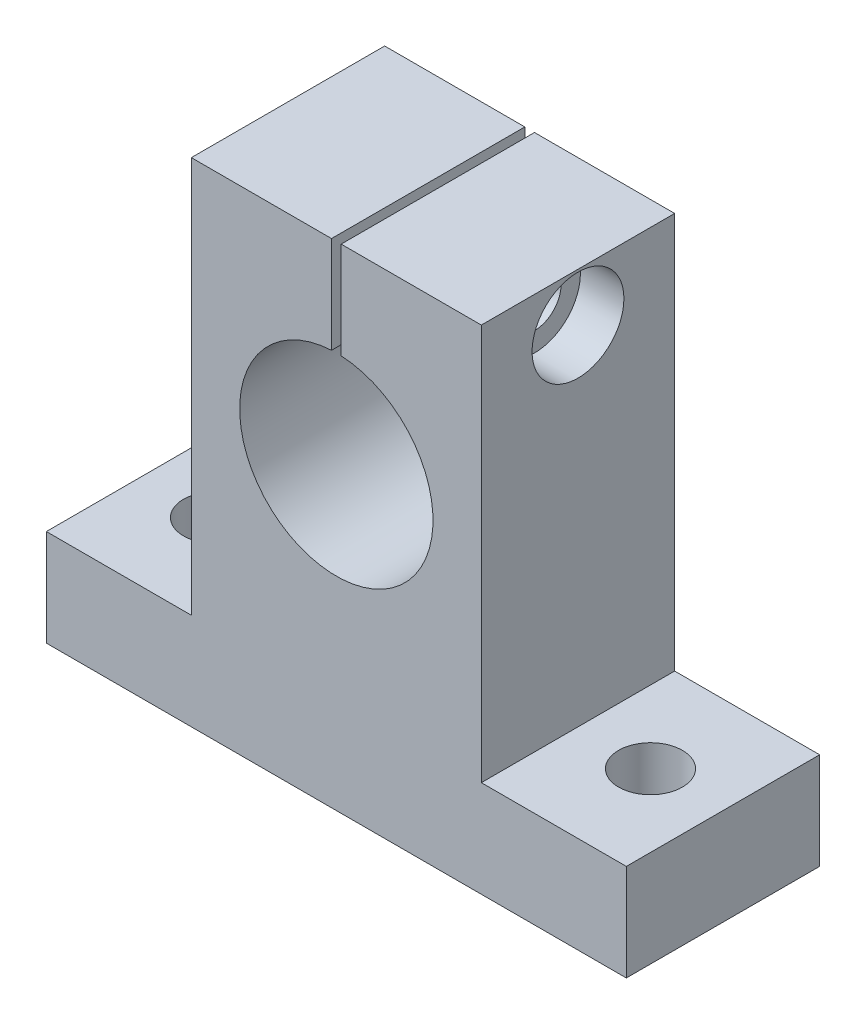
ISO-10303-21;
HEADER;
FILE_DESCRIPTION(('STEP AP214'),'2;1');
FILE_NAME('part.step','',(''),(''),'','','');
FILE_SCHEMA(('AUTOMOTIVE_DESIGN { 1 0 10303 214 1 1 1 1 }'));
ENDSEC;
DATA;
#1=APPLICATION_CONTEXT('core data for automotive mechanical design processes');
#2=APPLICATION_PROTOCOL_DEFINITION('international standard','automotive_design',2000,#1);
#3=PRODUCT_CONTEXT('',#1,'mechanical');
#4=PRODUCT('Part','Part','',(#3));
#5=PRODUCT_RELATED_PRODUCT_CATEGORY('part','',(#4));
#6=PRODUCT_DEFINITION_FORMATION('','',#4);
#7=PRODUCT_DEFINITION_CONTEXT('part definition',#1,'design');
#8=PRODUCT_DEFINITION('design','',#6,#7);
#9=PRODUCT_DEFINITION_SHAPE('','',#8);
#10=(LENGTH_UNIT() NAMED_UNIT(*) SI_UNIT(.MILLI.,.METRE.));
#11=(NAMED_UNIT(*) PLANE_ANGLE_UNIT() SI_UNIT($,.RADIAN.));
#12=(NAMED_UNIT(*) SI_UNIT($,.STERADIAN.) SOLID_ANGLE_UNIT());
#13=UNCERTAINTY_MEASURE_WITH_UNIT(LENGTH_MEASURE(1.E-05),#10,'distance_accuracy_value','');
#14=(GEOMETRIC_REPRESENTATION_CONTEXT(3) GLOBAL_UNCERTAINTY_ASSIGNED_CONTEXT((#13)) GLOBAL_UNIT_ASSIGNED_CONTEXT((#10,
#11,#12)) REPRESENTATION_CONTEXT('',''));
#15=CARTESIAN_POINT('',(0.,0.,0.));
#16=DIRECTION('',(0.,0.,1.));
#17=DIRECTION('',(1.,0.,0.));
#18=AXIS2_PLACEMENT_3D('',#15,#16,#17);
#19=CARTESIAN_POINT('',(40.8020446051646,48.6470920161527,10.));
#20=DIRECTION('',(-1.,0.,0.));
#21=DIRECTION('',(0.,0.,1.));
#22=AXIS2_PLACEMENT_3D('',#19,#20,#21);
#23=PLANE('',#22);
#24=CARTESIAN_POINT('',(40.8020446051646,43.8970920161528,10.));
#25=DIRECTION('',(1.,0.,0.));
#26=DIRECTION('',(0.,0.,-1.));
#27=AXIS2_PLACEMENT_3D('',#24,#25,#26);
#28=CIRCLE('',#27,2.74999999999998);
#29=CARTESIAN_POINT('',(40.8020446051646,43.8970920161528,7.25000000000004));
#30=VERTEX_POINT('',#29);
#31=EDGE_CURVE('E112',#30,#30,#28,.F.);
#32=ORIENTED_EDGE('',*,*,#31,.T.);
#33=EDGE_LOOP('',(#32));
#34=FACE_BOUND('',#33,.T.);
#35=CARTESIAN_POINT('',(40.8020446051646,43.8970920161528,10.));
#36=DIRECTION('',(1.,0.,0.));
#37=DIRECTION('',(0.,0.,-1.));
#38=AXIS2_PLACEMENT_3D('',#35,#36,#37);
#39=CIRCLE('',#38,4.74999999999999);
#40=CARTESIAN_POINT('',(40.8020446051646,43.8970920161528,5.25000000000001));
#41=VERTEX_POINT('',#40);
#42=EDGE_CURVE('E19',#41,#41,#39,.T.);
#43=ORIENTED_EDGE('',*,*,#42,.T.);
#44=EDGE_LOOP('',(#43));
#45=FACE_BOUND('',#44,.T.);
#46=ADVANCED_FACE('F16',(#34,#45),#23,.F.);
#47=CARTESIAN_POINT('',(22.5520446051646,43.8970920161528,10.));
#48=DIRECTION('',(1.,0.,0.));
#49=DIRECTION('',(0.,0.,-1.));
#50=AXIS2_PLACEMENT_3D('',#47,#48,#49);
#51=CYLINDRICAL_SURFACE('',#50,1.69999999999999);
#52=CARTESIAN_POINT('',(15.3020446051646,43.8970920161528,10.));
#53=DIRECTION('',(1.,0.,0.));
#54=DIRECTION('',(0.,0.,-1.));
#55=AXIS2_PLACEMENT_3D('',#52,#53,#54);
#56=CIRCLE('',#55,1.69999999999999);
#57=CARTESIAN_POINT('',(15.3020446051646,43.8970920161528,8.30000000000002));
#58=VERTEX_POINT('',#57);
#59=EDGE_CURVE('E164',#58,#58,#56,.T.);
#60=ORIENTED_EDGE('',*,*,#59,.F.);
#61=EDGE_LOOP('',(#60));
#62=FACE_BOUND('',#61,.T.);
#63=CARTESIAN_POINT('',(29.8020446051646,43.8970920161528,10.));
#64=DIRECTION('',(1.,0.,0.));
#65=DIRECTION('',(0.,0.,-1.));
#66=AXIS2_PLACEMENT_3D('',#63,#64,#65);
#67=CIRCLE('',#66,1.69999999999999);
#68=CARTESIAN_POINT('',(29.8020446051646,43.8970920161528,8.30000000000002));
#69=VERTEX_POINT('',#68);
#70=EDGE_CURVE('E199',#69,#69,#67,.T.);
#71=ORIENTED_EDGE('',*,*,#70,.T.);
#72=EDGE_LOOP('',(#71));
#73=FACE_BOUND('',#72,.T.);
#74=ADVANCED_FACE('F493',(#62,#73),#51,.F.);
#75=CARTESIAN_POINT('',(7.80204460516461,2.90334592729319,10.));
#76=DIRECTION('',(0.,1.,0.));
#77=DIRECTION('',(-1.,0.,0.));
#78=AXIS2_PLACEMENT_3D('',#75,#76,#77);
#79=CYLINDRICAL_SURFACE('',#78,3.3);
#80=CARTESIAN_POINT('',(7.80204460516461,-2.09665407270681,10.));
#81=DIRECTION('',(0.,1.,0.));
#82=DIRECTION('',(-1.,0.,0.));
#83=AXIS2_PLACEMENT_3D('',#80,#81,#82);
#84=CIRCLE('',#83,3.3);
#85=CARTESIAN_POINT('',(4.50204460516461,-2.09665407270681,10.));
#86=VERTEX_POINT('',#85);
#87=EDGE_CURVE('E147',#86,#86,#84,.T.);
#88=ORIENTED_EDGE('',*,*,#87,.F.);
#89=EDGE_LOOP('',(#88));
#90=FACE_BOUND('',#89,.T.);
#91=CARTESIAN_POINT('',(7.80204460516461,7.90334592729319,10.));
#92=DIRECTION('',(0.,1.,0.));
#93=DIRECTION('',(-1.,0.,0.));
#94=AXIS2_PLACEMENT_3D('',#91,#92,#93);
#95=CIRCLE('',#94,3.3);
#96=CARTESIAN_POINT('',(4.50204460516461,7.90334592729319,10.));
#97=VERTEX_POINT('',#96);
#98=EDGE_CURVE('E158',#97,#97,#95,.F.);
#99=ORIENTED_EDGE('',*,*,#98,.F.);
#100=EDGE_LOOP('',(#99));
#101=FACE_BOUND('',#100,.T.);
#102=ADVANCED_FACE('F484',(#90,#101),#79,.F.);
#103=CARTESIAN_POINT('',(52.8020446051646,2.90334592729319,10.));
#104=DIRECTION('',(0.,1.,0.));
#105=DIRECTION('',(0.,0.,1.));
#106=AXIS2_PLACEMENT_3D('',#103,#104,#105);
#107=CYLINDRICAL_SURFACE('',#106,3.29999999999999);
#108=CARTESIAN_POINT('',(52.8020446051646,-2.09665407270681,10.));
#109=DIRECTION('',(0.,1.,0.));
#110=DIRECTION('',(0.,0.,1.));
#111=AXIS2_PLACEMENT_3D('',#108,#109,#110);
#112=CIRCLE('',#111,3.29999999999999);
#113=CARTESIAN_POINT('',(52.8020446051646,-2.09665407270681,13.3));
#114=VERTEX_POINT('',#113);
#115=EDGE_CURVE('E192',#114,#114,#112,.T.);
#116=ORIENTED_EDGE('',*,*,#115,.F.);
#117=EDGE_LOOP('',(#116));
#118=FACE_BOUND('',#117,.T.);
#119=CARTESIAN_POINT('',(52.8020446051646,7.90334592729319,10.));
#120=DIRECTION('',(0.,1.,0.));
#121=DIRECTION('',(0.,0.,1.));
#122=AXIS2_PLACEMENT_3D('',#119,#120,#121);
#123=CIRCLE('',#122,3.29999999999999);
#124=CARTESIAN_POINT('',(52.8020446051646,7.90334592729319,13.3));
#125=VERTEX_POINT('',#124);
#126=EDGE_CURVE('E136',#125,#125,#123,.F.);
#127=ORIENTED_EDGE('',*,*,#126,.F.);
#128=EDGE_LOOP('',(#127));
#129=FACE_BOUND('',#128,.T.);
#130=ADVANCED_FACE('F211',(#118,#129),#107,.F.);
#131=CARTESIAN_POINT('',(43.0520446051646,43.8970920161528,10.));
#132=DIRECTION('',(1.,0.,0.));
#133=DIRECTION('',(0.,0.,-1.));
#134=AXIS2_PLACEMENT_3D('',#131,#132,#133);
#135=CYLINDRICAL_SURFACE('',#134,4.74999999999999);
#136=ORIENTED_EDGE('',*,*,#42,.F.);
#137=EDGE_LOOP('',(#136));
#138=FACE_BOUND('',#137,.T.);
#139=CARTESIAN_POINT('',(45.3020446051646,43.8970920161528,10.));
#140=DIRECTION('',(1.,0.,0.));
#141=DIRECTION('',(0.,0.,-1.));
#142=AXIS2_PLACEMENT_3D('',#139,#140,#141);
#143=CIRCLE('',#142,4.74999999999999);
#144=CARTESIAN_POINT('',(45.3020446051646,43.8970920161528,5.25000000000001));
#145=VERTEX_POINT('',#144);
#146=EDGE_CURVE('E130',#145,#145,#143,.F.);
#147=ORIENTED_EDGE('',*,*,#146,.F.);
#148=EDGE_LOOP('',(#147));
#149=FACE_BOUND('',#148,.T.);
#150=ADVANCED_FACE('F208',(#138,#149),#135,.F.);
#151=CARTESIAN_POINT('',(30.3020446051646,17.8628053867526,20.));
#152=DIRECTION('',(0.,0.,1.));
#153=DIRECTION('',(1.,0.,0.));
#154=AXIS2_PLACEMENT_3D('',#151,#152,#153);
#155=PLANE('',#154);
#156=DIRECTION('',(0.,1.,0.));
#157=VECTOR('',#156,1.);
#158=CARTESIAN_POINT('',(30.8020446051646,48.9033459272932,20.));
#159=LINE('',#158,#157);
#160=CARTESIAN_POINT('',(30.8020446051646,48.9033459272932,20.));
#161=VERTEX_POINT('',#160);
#162=CARTESIAN_POINT('',(30.8020446051646,38.8908381050123,20.));
#163=VERTEX_POINT('',#162);
#164=EDGE_CURVE('E115',#161,#163,#159,.F.);
#165=ORIENTED_EDGE('',*,*,#164,.T.);
#166=CARTESIAN_POINT('',(30.3020446051646,28.9033459272932,20.));
#167=DIRECTION('',(0.,0.,1.));
#168=DIRECTION('',(1.,0.,0.));
#169=AXIS2_PLACEMENT_3D('',#166,#167,#168);
#170=CIRCLE('',#169,10.);
#171=CARTESIAN_POINT('',(29.8020446051646,38.8908381050123,20.));
#172=VERTEX_POINT('',#171);
#173=EDGE_CURVE('E103',#163,#172,#170,.F.);
#174=ORIENTED_EDGE('',*,*,#173,.T.);
#175=DIRECTION('',(0.,1.,0.));
#176=VECTOR('',#175,1.);
#177=CARTESIAN_POINT('',(29.8020446051646,48.9033459272932,20.));
#178=LINE('',#177,#176);
#179=CARTESIAN_POINT('',(29.8020446051646,48.9033459272932,20.));
#180=VERTEX_POINT('',#179);
#181=EDGE_CURVE('E111',#172,#180,#178,.T.);
#182=ORIENTED_EDGE('',*,*,#181,.T.);
#183=DIRECTION('',(1.,0.,0.));
#184=VECTOR('',#183,1.);
#185=CARTESIAN_POINT('',(15.3020446051646,48.9033459272932,20.));
#186=LINE('',#185,#184);
#187=CARTESIAN_POINT('',(15.3020446051646,48.9033459272932,20.));
#188=VERTEX_POINT('',#187);
#189=EDGE_CURVE('E170',#188,#180,#186,.T.);
#190=ORIENTED_EDGE('',*,*,#189,.F.);
#191=DIRECTION('',(0.,1.,0.));
#192=VECTOR('',#191,1.);
#193=CARTESIAN_POINT('',(15.3020446051646,7.90334592729319,20.));
#194=LINE('',#193,#192);
#195=CARTESIAN_POINT('',(15.3020446051646,7.90334592729319,20.));
#196=VERTEX_POINT('',#195);
#197=EDGE_CURVE('E167',#196,#188,#194,.T.);
#198=ORIENTED_EDGE('',*,*,#197,.F.);
#199=DIRECTION('',(1.,0.,0.));
#200=VECTOR('',#199,1.);
#201=CARTESIAN_POINT('',(0.302044605164609,7.90334592729319,20.));
#202=LINE('',#201,#200);
#203=CARTESIAN_POINT('',(0.302044605164612,7.90334592729319,20.));
#204=VERTEX_POINT('',#203);
#205=EDGE_CURVE('E161',#204,#196,#202,.T.);
#206=ORIENTED_EDGE('',*,*,#205,.F.);
#207=DIRECTION('',(0.,1.,0.));
#208=VECTOR('',#207,1.);
#209=CARTESIAN_POINT('',(0.302044605164612,-2.09665407270681,20.));
#210=LINE('',#209,#208);
#211=CARTESIAN_POINT('',(0.302044605164613,-2.09665407270681,20.));
#212=VERTEX_POINT('',#211);
#213=EDGE_CURVE('E156',#212,#204,#210,.T.);
#214=ORIENTED_EDGE('',*,*,#213,.F.);
#215=DIRECTION('',(1.,0.,0.));
#216=VECTOR('',#215,1.);
#217=CARTESIAN_POINT('',(60.3020446051646,-2.09665407270681,20.));
#218=LINE('',#217,#216);
#219=CARTESIAN_POINT('',(60.3020446051646,-2.09665407270681,20.));
#220=VERTEX_POINT('',#219);
#221=EDGE_CURVE('E150',#220,#212,#218,.F.);
#222=ORIENTED_EDGE('',*,*,#221,.F.);
#223=DIRECTION('',(0.,1.,0.));
#224=VECTOR('',#223,1.);
#225=CARTESIAN_POINT('',(60.3020446051646,7.90334592729319,20.));
#226=LINE('',#225,#224);
#227=CARTESIAN_POINT('',(60.3020446051646,7.90334592729319,20.));
#228=VERTEX_POINT('',#227);
#229=EDGE_CURVE('E145',#228,#220,#226,.F.);
#230=ORIENTED_EDGE('',*,*,#229,.F.);
#231=DIRECTION('',(1.,0.,0.));
#232=VECTOR('',#231,1.);
#233=CARTESIAN_POINT('',(45.3020446051646,7.90334592729319,20.));
#234=LINE('',#233,#232);
#235=CARTESIAN_POINT('',(45.3020446051646,7.90334592729319,20.));
#236=VERTEX_POINT('',#235);
#237=EDGE_CURVE('E139',#236,#228,#234,.T.);
#238=ORIENTED_EDGE('',*,*,#237,.F.);
#239=DIRECTION('',(0.,1.,0.));
#240=VECTOR('',#239,1.);
#241=CARTESIAN_POINT('',(45.3020446051646,48.9033459272932,20.));
#242=LINE('',#241,#240);
#243=CARTESIAN_POINT('',(45.3020446051646,48.9033459272932,20.));
#244=VERTEX_POINT('',#243);
#245=EDGE_CURVE('E133',#244,#236,#242,.F.);
#246=ORIENTED_EDGE('',*,*,#245,.F.);
#247=DIRECTION('',(1.,0.,0.));
#248=VECTOR('',#247,1.);
#249=CARTESIAN_POINT('',(15.3020446051646,48.9033459272932,20.));
#250=LINE('',#249,#248);
#251=EDGE_CURVE('E120',#161,#244,#250,.T.);
#252=ORIENTED_EDGE('',*,*,#251,.F.);
#253=EDGE_LOOP('',(#165,#174,#182,#190,#198,#206,#214,#222,#230,#238,#246,#252));
#254=FACE_BOUND('',#253,.T.);
#255=ADVANCED_FACE('F118',(#254),#155,.T.);
#256=CARTESIAN_POINT('',(35.8020446051646,43.8970920161528,10.));
#257=DIRECTION('',(1.,0.,0.));
#258=DIRECTION('',(0.,0.,-1.));
#259=AXIS2_PLACEMENT_3D('',#256,#257,#258);
#260=CYLINDRICAL_SURFACE('',#259,2.74999999999998);
#261=CARTESIAN_POINT('',(30.8020446051646,43.8970920161528,10.));
#262=DIRECTION('',(1.,0.,0.));
#263=DIRECTION('',(0.,0.,-1.));
#264=AXIS2_PLACEMENT_3D('',#261,#262,#263);
#265=CIRCLE('',#264,2.74999999999998);
#266=CARTESIAN_POINT('',(30.8020446051646,43.8970920161528,7.25000000000004));
#267=VERTEX_POINT('',#266);
#268=EDGE_CURVE('E116',#267,#267,#265,.F.);
#269=ORIENTED_EDGE('',*,*,#268,.T.);
#270=EDGE_LOOP('',(#269));
#271=FACE_BOUND('',#270,.T.);
#272=ORIENTED_EDGE('',*,*,#31,.F.);
#273=EDGE_LOOP('',(#272));
#274=FACE_BOUND('',#273,.T.);
#275=ADVANCED_FACE('F456',(#271,#274),#260,.F.);
#276=CARTESIAN_POINT('',(30.3020446051646,28.9033459272932,0.));
#277=DIRECTION('',(0.,0.,1.));
#278=DIRECTION('',(1.,0.,0.));
#279=AXIS2_PLACEMENT_3D('',#276,#277,#278);
#280=CYLINDRICAL_SURFACE('',#279,10.);
#281=DIRECTION('',(0.,0.,-1.));
#282=VECTOR('',#281,1.);
#283=CARTESIAN_POINT('',(30.8020446051646,38.8908381050123,20.));
#284=LINE('',#283,#282);
#285=CARTESIAN_POINT('',(30.8020446051646,38.8908381050123,0.));
#286=VERTEX_POINT('',#285);
#287=EDGE_CURVE('E107',#163,#286,#284,.T.);
#288=ORIENTED_EDGE('',*,*,#287,.T.);
#289=CARTESIAN_POINT('',(30.3020446051646,28.9033459272932,0.));
#290=DIRECTION('',(0.,0.,1.));
#291=DIRECTION('',(1.,0.,0.));
#292=AXIS2_PLACEMENT_3D('',#289,#290,#291);
#293=CIRCLE('',#292,10.);
#294=CARTESIAN_POINT('',(29.8020446051646,38.8908381050123,0.));
#295=VERTEX_POINT('',#294);
#296=EDGE_CURVE('E181',#286,#295,#293,.F.);
#297=ORIENTED_EDGE('',*,*,#296,.T.);
#298=DIRECTION('',(0.,0.,1.));
#299=VECTOR('',#298,1.);
#300=CARTESIAN_POINT('',(29.8020446051646,38.8908381050123,0.));
#301=LINE('',#300,#299);
#302=EDGE_CURVE('E108',#295,#172,#301,.T.);
#303=ORIENTED_EDGE('',*,*,#302,.T.);
#304=ORIENTED_EDGE('',*,*,#173,.F.);
#305=EDGE_LOOP('',(#288,#297,#303,#304));
#306=FACE_BOUND('',#305,.T.);
#307=ADVANCED_FACE('F105',(#306),#280,.F.);
#308=CARTESIAN_POINT('',(29.8020446051646,48.9033459272932,0.));
#309=DIRECTION('',(-1.,0.,0.));
#310=DIRECTION('',(0.,0.,1.));
#311=AXIS2_PLACEMENT_3D('',#308,#309,#310);
#312=PLANE('',#311);
#313=ORIENTED_EDGE('',*,*,#70,.F.);
#314=EDGE_LOOP('',(#313));
#315=FACE_BOUND('',#314,.T.);
#316=DIRECTION('',(0.,1.,0.));
#317=VECTOR('',#316,1.);
#318=CARTESIAN_POINT('',(29.8020446051646,17.8628053867526,0.));
#319=LINE('',#318,#317);
#320=CARTESIAN_POINT('',(29.8020446051646,48.9033459272932,0.));
#321=VERTEX_POINT('',#320);
#322=EDGE_CURVE('E183',#295,#321,#319,.T.);
#323=ORIENTED_EDGE('',*,*,#322,.T.);
#324=DIRECTION('',(0.,0.,1.));
#325=VECTOR('',#324,1.);
#326=CARTESIAN_POINT('',(29.8020446051646,48.9033459272932,0.));
#327=LINE('',#326,#325);
#328=EDGE_CURVE('E175',#180,#321,#327,.F.);
#329=ORIENTED_EDGE('',*,*,#328,.F.);
#330=ORIENTED_EDGE('',*,*,#181,.F.);
#331=ORIENTED_EDGE('',*,*,#302,.F.);
#332=EDGE_LOOP('',(#323,#329,#330,#331));
#333=FACE_BOUND('',#332,.T.);
#334=ADVANCED_FACE('F308',(#315,#333),#312,.F.);
#335=CARTESIAN_POINT('',(15.3020446051646,48.9033459272932,0.));
#336=DIRECTION('',(0.,1.,0.));
#337=DIRECTION('',(0.,0.,1.));
#338=AXIS2_PLACEMENT_3D('',#335,#336,#337);
#339=PLANE('',#338);
#340=DIRECTION('',(0.,0.,1.));
#341=VECTOR('',#340,1.);
#342=CARTESIAN_POINT('',(15.3020446051646,48.9033459272932,0.));
#343=LINE('',#342,#341);
#344=CARTESIAN_POINT('',(15.3020446051646,48.9033459272932,0.));
#345=VERTEX_POINT('',#344);
#346=EDGE_CURVE('E169',#188,#345,#343,.F.);
#347=ORIENTED_EDGE('',*,*,#346,.F.);
#348=ORIENTED_EDGE('',*,*,#189,.T.);
#349=ORIENTED_EDGE('',*,*,#328,.T.);
#350=DIRECTION('',(1.,0.,0.));
#351=VECTOR('',#350,1.);
#352=CARTESIAN_POINT('',(30.3020446051646,48.9033459272932,0.));
#353=LINE('',#352,#351);
#354=EDGE_CURVE('E284',#321,#345,#353,.F.);
#355=ORIENTED_EDGE('',*,*,#354,.T.);
#356=EDGE_LOOP('',(#347,#348,#349,#355));
#357=FACE_BOUND('',#356,.T.);
#358=ADVANCED_FACE('F299',(#357),#339,.T.);
#359=CARTESIAN_POINT('',(15.3020446051646,7.90334592729319,0.));
#360=DIRECTION('',(-1.,0.,0.));
#361=DIRECTION('',(0.,0.,1.));
#362=AXIS2_PLACEMENT_3D('',#359,#360,#361);
#363=PLANE('',#362);
#364=ORIENTED_EDGE('',*,*,#59,.T.);
#365=EDGE_LOOP('',(#364));
#366=FACE_BOUND('',#365,.T.);
#367=DIRECTION('',(0.,1.,0.));
#368=VECTOR('',#367,1.);
#369=CARTESIAN_POINT('',(15.3020446051646,17.8628053867526,0.));
#370=LINE('',#369,#368);
#371=CARTESIAN_POINT('',(15.3020446051646,7.90334592729319,0.));
#372=VERTEX_POINT('',#371);
#373=EDGE_CURVE('E276',#345,#372,#370,.F.);
#374=ORIENTED_EDGE('',*,*,#373,.T.);
#375=DIRECTION('',(0.,0.,1.));
#376=VECTOR('',#375,1.);
#377=CARTESIAN_POINT('',(15.3020446051646,7.90334592729319,0.));
#378=LINE('',#377,#376);
#379=EDGE_CURVE('E163',#196,#372,#378,.F.);
#380=ORIENTED_EDGE('',*,*,#379,.F.);
#381=ORIENTED_EDGE('',*,*,#197,.T.);
#382=ORIENTED_EDGE('',*,*,#346,.T.);
#383=EDGE_LOOP('',(#374,#380,#381,#382));
#384=FACE_BOUND('',#383,.T.);
#385=ADVANCED_FACE('F343',(#366,#384),#363,.T.);
#386=CARTESIAN_POINT('',(0.302044605164609,7.90334592729319,0.));
#387=DIRECTION('',(0.,1.,0.));
#388=DIRECTION('',(0.,0.,1.));
#389=AXIS2_PLACEMENT_3D('',#386,#387,#388);
#390=PLANE('',#389);
#391=ORIENTED_EDGE('',*,*,#98,.T.);
#392=EDGE_LOOP('',(#391));
#393=FACE_BOUND('',#392,.T.);
#394=DIRECTION('',(1.,0.,0.));
#395=VECTOR('',#394,1.);
#396=CARTESIAN_POINT('',(30.3020446051646,7.90334592729319,0.));
#397=LINE('',#396,#395);
#398=CARTESIAN_POINT('',(0.302044605164611,7.90334592729319,0.));
#399=VERTEX_POINT('',#398);
#400=EDGE_CURVE('E268',#372,#399,#397,.F.);
#401=ORIENTED_EDGE('',*,*,#400,.T.);
#402=DIRECTION('',(0.,0.,1.));
#403=VECTOR('',#402,1.);
#404=CARTESIAN_POINT('',(0.302044605164612,7.90334592729319,0.));
#405=LINE('',#404,#403);
#406=EDGE_CURVE('E153',#204,#399,#405,.F.);
#407=ORIENTED_EDGE('',*,*,#406,.F.);
#408=ORIENTED_EDGE('',*,*,#205,.T.);
#409=ORIENTED_EDGE('',*,*,#379,.T.);
#410=EDGE_LOOP('',(#401,#407,#408,#409));
#411=FACE_BOUND('',#410,.T.);
#412=ADVANCED_FACE('F339',(#393,#411),#390,.T.);
#413=CARTESIAN_POINT('',(0.302044605164612,-2.09665407270681,0.));
#414=DIRECTION('',(-1.,0.,0.));
#415=DIRECTION('',(0.,0.,1.));
#416=AXIS2_PLACEMENT_3D('',#413,#414,#415);
#417=PLANE('',#416);
#418=DIRECTION('',(0.,1.,0.));
#419=VECTOR('',#418,1.);
#420=CARTESIAN_POINT('',(0.302044605164611,17.8628053867526,0.));
#421=LINE('',#420,#419);
#422=CARTESIAN_POINT('',(0.302044605164612,-2.09665407270681,0.));
#423=VERTEX_POINT('',#422);
#424=EDGE_CURVE('E260',#399,#423,#421,.F.);
#425=ORIENTED_EDGE('',*,*,#424,.T.);
#426=DIRECTION('',(0.,0.,-1.));
#427=VECTOR('',#426,1.);
#428=CARTESIAN_POINT('',(0.302044605164614,-2.09665407270681,0.));
#429=LINE('',#428,#427);
#430=EDGE_CURVE('E152',#212,#423,#429,.T.);
#431=ORIENTED_EDGE('',*,*,#430,.F.);
#432=ORIENTED_EDGE('',*,*,#213,.T.);
#433=ORIENTED_EDGE('',*,*,#406,.T.);
#434=EDGE_LOOP('',(#425,#431,#432,#433));
#435=FACE_BOUND('',#434,.T.);
#436=ADVANCED_FACE('F335',(#435),#417,.T.);
#437=CARTESIAN_POINT('',(60.3020446051646,-2.09665407270681,0.));
#438=DIRECTION('',(0.,-1.,0.));
#439=DIRECTION('',(0.,0.,-1.));
#440=AXIS2_PLACEMENT_3D('',#437,#438,#439);
#441=PLANE('',#440);
#442=ORIENTED_EDGE('',*,*,#87,.T.);
#443=EDGE_LOOP('',(#442));
#444=FACE_BOUND('',#443,.T.);
#445=ORIENTED_EDGE('',*,*,#115,.T.);
#446=EDGE_LOOP('',(#445));
#447=FACE_BOUND('',#446,.T.);
#448=DIRECTION('',(1.,0.,0.));
#449=VECTOR('',#448,1.);
#450=CARTESIAN_POINT('',(30.3020446051646,-2.09665407270681,0.));
#451=LINE('',#450,#449);
#452=CARTESIAN_POINT('',(60.3020446051646,-2.09665407270681,0.));
#453=VERTEX_POINT('',#452);
#454=EDGE_CURVE('E252',#423,#453,#451,.T.);
#455=ORIENTED_EDGE('',*,*,#454,.T.);
#456=DIRECTION('',(0.,0.,-1.));
#457=VECTOR('',#456,1.);
#458=CARTESIAN_POINT('',(60.3020446051646,-2.09665407270681,0.));
#459=LINE('',#458,#457);
#460=EDGE_CURVE('E142',#220,#453,#459,.T.);
#461=ORIENTED_EDGE('',*,*,#460,.F.);
#462=ORIENTED_EDGE('',*,*,#221,.T.);
#463=ORIENTED_EDGE('',*,*,#430,.T.);
#464=EDGE_LOOP('',(#455,#461,#462,#463));
#465=FACE_BOUND('',#464,.T.);
#466=ADVANCED_FACE('F330',(#444,#447,#465),#441,.T.);
#467=CARTESIAN_POINT('',(60.3020446051646,7.90334592729319,0.));
#468=DIRECTION('',(1.,0.,0.));
#469=DIRECTION('',(0.,0.,-1.));
#470=AXIS2_PLACEMENT_3D('',#467,#468,#469);
#471=PLANE('',#470);
#472=DIRECTION('',(0.,1.,0.));
#473=VECTOR('',#472,1.);
#474=CARTESIAN_POINT('',(60.3020446051646,17.8628053867526,0.));
#475=LINE('',#474,#473);
#476=CARTESIAN_POINT('',(60.3020446051646,7.90334592729319,0.));
#477=VERTEX_POINT('',#476);
#478=EDGE_CURVE('E234',#453,#477,#475,.T.);
#479=ORIENTED_EDGE('',*,*,#478,.T.);
#480=DIRECTION('',(0.,0.,1.));
#481=VECTOR('',#480,1.);
#482=CARTESIAN_POINT('',(60.3020446051646,7.90334592729319,0.));
#483=LINE('',#482,#481);
#484=EDGE_CURVE('E141',#228,#477,#483,.F.);
#485=ORIENTED_EDGE('',*,*,#484,.F.);
#486=ORIENTED_EDGE('',*,*,#229,.T.);
#487=ORIENTED_EDGE('',*,*,#460,.T.);
#488=EDGE_LOOP('',(#479,#485,#486,#487));
#489=FACE_BOUND('',#488,.T.);
#490=ADVANCED_FACE('F327',(#489),#471,.T.);
#491=CARTESIAN_POINT('',(45.3020446051646,7.90334592729319,0.));
#492=DIRECTION('',(0.,1.,0.));
#493=DIRECTION('',(0.,0.,1.));
#494=AXIS2_PLACEMENT_3D('',#491,#492,#493);
#495=PLANE('',#494);
#496=ORIENTED_EDGE('',*,*,#126,.T.);
#497=EDGE_LOOP('',(#496));
#498=FACE_BOUND('',#497,.T.);
#499=DIRECTION('',(1.,0.,0.));
#500=VECTOR('',#499,1.);
#501=CARTESIAN_POINT('',(30.3020446051646,7.90334592729319,0.));
#502=LINE('',#501,#500);
#503=CARTESIAN_POINT('',(45.3020446051646,7.90334592729319,0.));
#504=VERTEX_POINT('',#503);
#505=EDGE_CURVE('E230',#477,#504,#502,.F.);
#506=ORIENTED_EDGE('',*,*,#505,.T.);
#507=DIRECTION('',(0.,0.,-1.));
#508=VECTOR('',#507,1.);
#509=CARTESIAN_POINT('',(45.3020446051646,7.90334592729319,0.));
#510=LINE('',#509,#508);
#511=EDGE_CURVE('E135',#236,#504,#510,.T.);
#512=ORIENTED_EDGE('',*,*,#511,.F.);
#513=ORIENTED_EDGE('',*,*,#237,.T.);
#514=ORIENTED_EDGE('',*,*,#484,.T.);
#515=EDGE_LOOP('',(#506,#512,#513,#514));
#516=FACE_BOUND('',#515,.T.);
#517=ADVANCED_FACE('F219',(#498,#516),#495,.T.);
#518=CARTESIAN_POINT('',(45.3020446051646,48.9033459272932,0.));
#519=DIRECTION('',(1.,0.,0.));
#520=DIRECTION('',(0.,0.,-1.));
#521=AXIS2_PLACEMENT_3D('',#518,#519,#520);
#522=PLANE('',#521);
#523=ORIENTED_EDGE('',*,*,#146,.T.);
#524=EDGE_LOOP('',(#523));
#525=FACE_BOUND('',#524,.T.);
#526=DIRECTION('',(0.,1.,0.));
#527=VECTOR('',#526,1.);
#528=CARTESIAN_POINT('',(45.3020446051646,17.8628053867526,0.));
#529=LINE('',#528,#527);
#530=CARTESIAN_POINT('',(45.3020446051646,48.9033459272932,0.));
#531=VERTEX_POINT('',#530);
#532=EDGE_CURVE('E224',#504,#531,#529,.T.);
#533=ORIENTED_EDGE('',*,*,#532,.T.);
#534=DIRECTION('',(0.,0.,1.));
#535=VECTOR('',#534,1.);
#536=CARTESIAN_POINT('',(45.3020446051646,48.9033459272932,0.));
#537=LINE('',#536,#535);
#538=EDGE_CURVE('E122',#244,#531,#537,.F.);
#539=ORIENTED_EDGE('',*,*,#538,.F.);
#540=ORIENTED_EDGE('',*,*,#245,.T.);
#541=ORIENTED_EDGE('',*,*,#511,.T.);
#542=EDGE_LOOP('',(#533,#539,#540,#541));
#543=FACE_BOUND('',#542,.T.);
#544=ADVANCED_FACE('F215',(#525,#543),#522,.T.);
#545=CARTESIAN_POINT('',(15.3020446051646,48.9033459272932,0.));
#546=DIRECTION('',(0.,1.,0.));
#547=DIRECTION('',(0.,0.,1.));
#548=AXIS2_PLACEMENT_3D('',#545,#546,#547);
#549=PLANE('',#548);
#550=ORIENTED_EDGE('',*,*,#538,.T.);
#551=DIRECTION('',(1.,0.,0.));
#552=VECTOR('',#551,1.);
#553=CARTESIAN_POINT('',(30.3020446051646,48.9033459272932,0.));
#554=LINE('',#553,#552);
#555=CARTESIAN_POINT('',(30.8020446051646,48.9033459272932,0.));
#556=VERTEX_POINT('',#555);
#557=EDGE_CURVE('E25',#531,#556,#554,.F.);
#558=ORIENTED_EDGE('',*,*,#557,.T.);
#559=DIRECTION('',(0.,0.,-1.));
#560=VECTOR('',#559,1.);
#561=CARTESIAN_POINT('',(30.8020446051646,48.9033459272932,20.));
#562=LINE('',#561,#560);
#563=EDGE_CURVE('E33',#556,#161,#562,.F.);
#564=ORIENTED_EDGE('',*,*,#563,.T.);
#565=ORIENTED_EDGE('',*,*,#251,.T.);
#566=EDGE_LOOP('',(#550,#558,#564,#565));
#567=FACE_BOUND('',#566,.T.);
#568=ADVANCED_FACE('F218',(#567),#549,.T.);
#569=CARTESIAN_POINT('',(30.8020446051646,48.9033459272932,20.));
#570=DIRECTION('',(1.,0.,0.));
#571=DIRECTION('',(0.,0.,-1.));
#572=AXIS2_PLACEMENT_3D('',#569,#570,#571);
#573=PLANE('',#572);
#574=ORIENTED_EDGE('',*,*,#268,.F.);
#575=EDGE_LOOP('',(#574));
#576=FACE_BOUND('',#575,.T.);
#577=ORIENTED_EDGE('',*,*,#164,.F.);
#578=ORIENTED_EDGE('',*,*,#563,.F.);
#579=DIRECTION('',(0.,1.,0.));
#580=VECTOR('',#579,1.);
#581=CARTESIAN_POINT('',(30.8020446051646,17.8628053867526,0.));
#582=LINE('',#581,#580);
#583=EDGE_CURVE('E10',#556,#286,#582,.F.);
#584=ORIENTED_EDGE('',*,*,#583,.T.);
#585=ORIENTED_EDGE('',*,*,#287,.F.);
#586=EDGE_LOOP('',(#577,#578,#584,#585));
#587=FACE_BOUND('',#586,.T.);
#588=ADVANCED_FACE('F114',(#576,#587),#573,.F.);
#589=CARTESIAN_POINT('',(30.3020446051646,17.8628053867526,0.));
#590=DIRECTION('',(0.,0.,1.));
#591=DIRECTION('',(1.,0.,0.));
#592=AXIS2_PLACEMENT_3D('',#589,#590,#591);
#593=PLANE('',#592);
#594=ORIENTED_EDGE('',*,*,#557,.F.);
#595=ORIENTED_EDGE('',*,*,#532,.F.);
#596=ORIENTED_EDGE('',*,*,#505,.F.);
#597=ORIENTED_EDGE('',*,*,#478,.F.);
#598=ORIENTED_EDGE('',*,*,#454,.F.);
#599=ORIENTED_EDGE('',*,*,#424,.F.);
#600=ORIENTED_EDGE('',*,*,#400,.F.);
#601=ORIENTED_EDGE('',*,*,#373,.F.);
#602=ORIENTED_EDGE('',*,*,#354,.F.);
#603=ORIENTED_EDGE('',*,*,#322,.F.);
#604=ORIENTED_EDGE('',*,*,#296,.F.);
#605=ORIENTED_EDGE('',*,*,#583,.F.);
#606=EDGE_LOOP('',(#594,#595,#596,#597,#598,#599,#600,#601,#602,#603,#604,#605));
#607=FACE_BOUND('',#606,.T.);
#608=ADVANCED_FACE('F306',(#607),#593,.F.);
#609=CLOSED_SHELL('',(#46,#74,#102,#130,#150,#255,#275,#307,#334,#358,#385,#412,#436,#466,#490,
#517,#544,#568,#588,#608));
#610=MANIFOLD_SOLID_BREP('B1',#609);
#611=ADVANCED_BREP_SHAPE_REPRESENTATION('',(#18,#610),#14);
#612=SHAPE_DEFINITION_REPRESENTATION(#9,#611);
ENDSEC;
END-ISO-10303-21;
